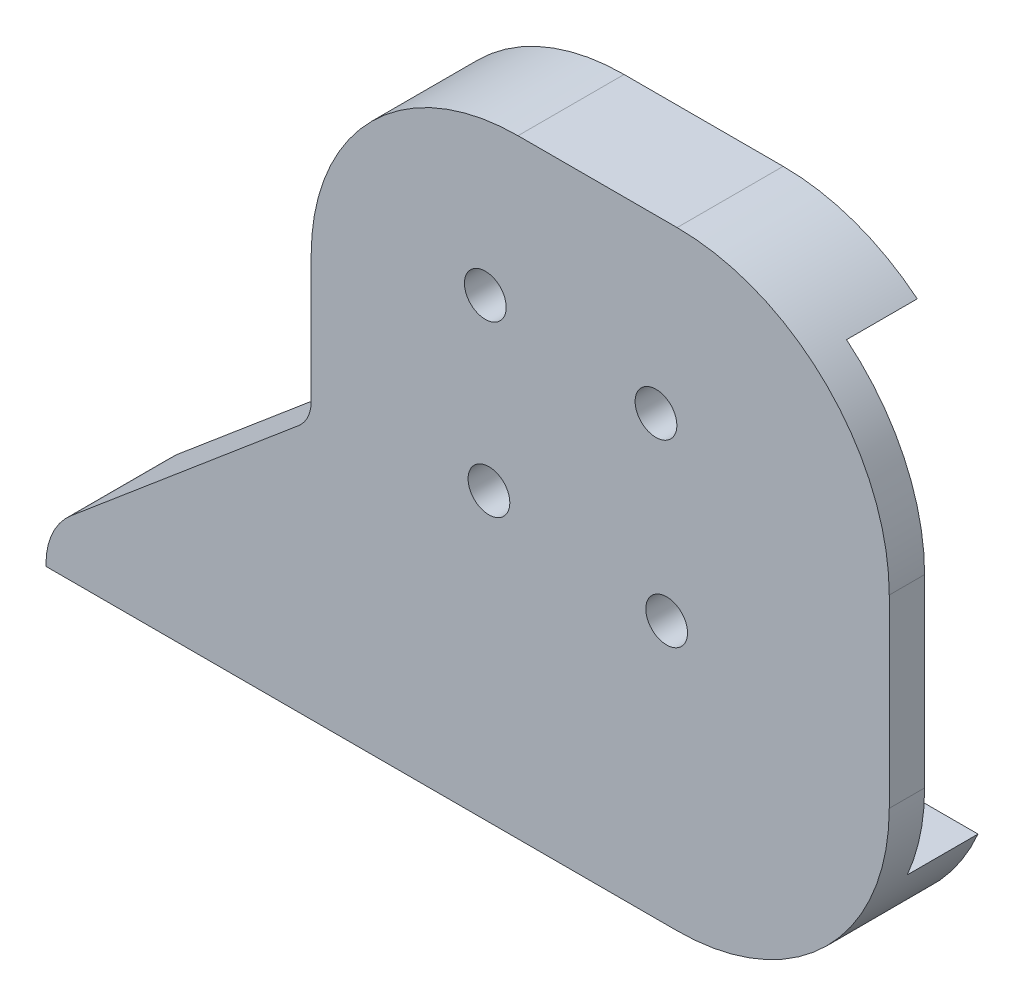
ISO-10303-21;
HEADER;
FILE_DESCRIPTION(('STEP AP214'),'2;1');
FILE_NAME('part.step','',(''),(''),'','','');
FILE_SCHEMA(('AUTOMOTIVE_DESIGN { 1 0 10303 214 1 1 1 1 }'));
ENDSEC;
DATA;
#1=APPLICATION_CONTEXT('core data for automotive mechanical design processes');
#2=APPLICATION_PROTOCOL_DEFINITION('international standard','automotive_design',2000,#1);
#3=PRODUCT_CONTEXT('',#1,'mechanical');
#4=PRODUCT('Part','Part','',(#3));
#5=PRODUCT_RELATED_PRODUCT_CATEGORY('part','',(#4));
#6=PRODUCT_DEFINITION_FORMATION('','',#4);
#7=PRODUCT_DEFINITION_CONTEXT('part definition',#1,'design');
#8=PRODUCT_DEFINITION('design','',#6,#7);
#9=PRODUCT_DEFINITION_SHAPE('','',#8);
#10=(LENGTH_UNIT() NAMED_UNIT(*) SI_UNIT(.MILLI.,.METRE.));
#11=(NAMED_UNIT(*) PLANE_ANGLE_UNIT() SI_UNIT($,.RADIAN.));
#12=(NAMED_UNIT(*) SI_UNIT($,.STERADIAN.) SOLID_ANGLE_UNIT());
#13=UNCERTAINTY_MEASURE_WITH_UNIT(LENGTH_MEASURE(1.E-05),#10,'distance_accuracy_value','');
#14=(GEOMETRIC_REPRESENTATION_CONTEXT(3) GLOBAL_UNCERTAINTY_ASSIGNED_CONTEXT((#13)) GLOBAL_UNIT_ASSIGNED_CONTEXT((#10,
#11,#12)) REPRESENTATION_CONTEXT('',''));
#15=CARTESIAN_POINT('',(0.,0.,0.));
#16=DIRECTION('',(0.,0.,1.));
#17=DIRECTION('',(1.,0.,0.));
#18=AXIS2_PLACEMENT_3D('',#15,#16,#17);
#19=CARTESIAN_POINT('',(0.,16.6219045973045,-7.62));
#20=DIRECTION('',(0.,1.,0.));
#21=DIRECTION('',(0.,0.,1.));
#22=AXIS2_PLACEMENT_3D('',#19,#20,#21);
#23=PLANE('',#22);
#24=DIRECTION('',(-1.,0.,0.));
#25=VECTOR('',#24,1.);
#26=CARTESIAN_POINT('',(0.,16.6219045973045,-7.62));
#27=LINE('',#26,#25);
#28=CARTESIAN_POINT('',(29.1227918090139,16.6219045973045,-7.62));
#29=VERTEX_POINT('',#28);
#30=CARTESIAN_POINT('',(8.0617026182734,16.6219045973045,-7.62));
#31=VERTEX_POINT('',#30);
#32=EDGE_CURVE('E222',#29,#31,#27,.T.);
#33=ORIENTED_EDGE('',*,*,#32,.F.);
#34=DIRECTION('',(0.,0.,1.));
#35=VECTOR('',#34,1.);
#36=CARTESIAN_POINT('',(29.1227918090139,16.6219045973045,-7.62));
#37=LINE('',#36,#35);
#38=CARTESIAN_POINT('',(29.1227918090139,16.6219045973045,-2.54));
#39=VERTEX_POINT('',#38);
#40=EDGE_CURVE('E271',#29,#39,#37,.T.);
#41=ORIENTED_EDGE('',*,*,#40,.T.);
#42=DIRECTION('',(-1.,0.,0.));
#43=VECTOR('',#42,1.);
#44=CARTESIAN_POINT('',(0.,16.6219045973045,-2.54));
#45=LINE('',#44,#43);
#46=CARTESIAN_POINT('',(8.0617026182734,16.6219045973045,-2.54));
#47=VERTEX_POINT('',#46);
#48=EDGE_CURVE('E184',#39,#47,#45,.T.);
#49=ORIENTED_EDGE('',*,*,#48,.T.);
#50=DIRECTION('',(0.,0.,1.));
#51=VECTOR('',#50,1.);
#52=CARTESIAN_POINT('',(8.0617026182734,16.6219045973045,-7.62));
#53=LINE('',#52,#51);
#54=EDGE_CURVE('E249',#31,#47,#53,.T.);
#55=ORIENTED_EDGE('',*,*,#54,.F.);
#56=EDGE_LOOP('',(#33,#41,#49,#55));
#57=FACE_BOUND('',#56,.T.);
#58=ADVANCED_FACE('F35',(#57),#23,.F.);
#59=CARTESIAN_POINT('',(8.0617026182734,5.19190459730453,-7.62));
#60=DIRECTION('',(0.,0.,1.));
#61=DIRECTION('',(1.,0.,0.));
#62=AXIS2_PLACEMENT_3D('',#59,#60,#61);
#63=CYLINDRICAL_SURFACE('',#62,11.43);
#64=CARTESIAN_POINT('',(8.0617026182734,5.19190459730453,-2.54));
#65=DIRECTION('',(0.,0.,1.));
#66=DIRECTION('',(1.,0.,0.));
#67=AXIS2_PLACEMENT_3D('',#64,#65,#66);
#68=CIRCLE('',#67,11.43);
#69=CARTESIAN_POINT('',(-3.3682973817266,5.19190459730453,-2.54));
#70=VERTEX_POINT('',#69);
#71=EDGE_CURVE('E186',#47,#70,#68,.T.);
#72=ORIENTED_EDGE('',*,*,#71,.T.);
#73=DIRECTION('',(0.,0.,1.));
#74=VECTOR('',#73,1.);
#75=CARTESIAN_POINT('',(-3.3682973817266,5.19190459730453,-7.62));
#76=LINE('',#75,#74);
#77=CARTESIAN_POINT('',(-3.3682973817266,5.19190459730453,-7.62));
#78=VERTEX_POINT('',#77);
#79=EDGE_CURVE('E252',#78,#70,#76,.T.);
#80=ORIENTED_EDGE('',*,*,#79,.F.);
#81=CARTESIAN_POINT('',(8.0617026182734,5.19190459730453,-7.62));
#82=DIRECTION('',(0.,0.,1.));
#83=DIRECTION('',(1.,0.,0.));
#84=AXIS2_PLACEMENT_3D('',#81,#82,#83);
#85=CIRCLE('',#84,11.43);
#86=EDGE_CURVE('E220',#31,#78,#85,.T.);
#87=ORIENTED_EDGE('',*,*,#86,.F.);
#88=ORIENTED_EDGE('',*,*,#54,.T.);
#89=EDGE_LOOP('',(#72,#80,#87,#88));
#90=FACE_BOUND('',#89,.T.);
#91=ADVANCED_FACE('F316',(#90),#63,.F.);
#92=CARTESIAN_POINT('',(-3.3682973817266,0.,-7.62));
#93=DIRECTION('',(1.,0.,0.));
#94=DIRECTION('',(0.,0.,-1.));
#95=AXIS2_PLACEMENT_3D('',#92,#93,#94);
#96=PLANE('',#95);
#97=ORIENTED_EDGE('',*,*,#79,.T.);
#98=DIRECTION('',(0.,-1.,0.));
#99=VECTOR('',#98,1.);
#100=CARTESIAN_POINT('',(-3.3682973817266,0.,-2.54));
#101=LINE('',#100,#99);
#102=CARTESIAN_POINT('',(-3.3682973817266,-14.4930954026955,-2.54));
#103=VERTEX_POINT('',#102);
#104=EDGE_CURVE('E175',#70,#103,#101,.T.);
#105=ORIENTED_EDGE('',*,*,#104,.T.);
#106=DIRECTION('',(0.,0.,1.));
#107=VECTOR('',#106,1.);
#108=CARTESIAN_POINT('',(-3.3682973817266,-14.4930954026955,-7.62));
#109=LINE('',#108,#107);
#110=CARTESIAN_POINT('',(-3.3682973817266,-14.4930954026955,-7.62));
#111=VERTEX_POINT('',#110);
#112=EDGE_CURVE('E232',#111,#103,#109,.T.);
#113=ORIENTED_EDGE('',*,*,#112,.F.);
#114=DIRECTION('',(0.,1.,0.));
#115=VECTOR('',#114,1.);
#116=CARTESIAN_POINT('',(-3.3682973817266,0.,-7.62));
#117=LINE('',#116,#115);
#118=EDGE_CURVE('E217',#111,#78,#117,.T.);
#119=ORIENTED_EDGE('',*,*,#118,.T.);
#120=EDGE_LOOP('',(#97,#105,#113,#119));
#121=FACE_BOUND('',#120,.T.);
#122=ADVANCED_FACE('F322',(#121),#96,.T.);
#123=CARTESIAN_POINT('',(0.,-14.4930954026955,-7.62));
#124=DIRECTION('',(0.,1.,0.));
#125=DIRECTION('',(0.,0.,1.));
#126=AXIS2_PLACEMENT_3D('',#123,#124,#125);
#127=PLANE('',#126);
#128=DIRECTION('',(-1.,0.,0.));
#129=VECTOR('',#128,1.);
#130=CARTESIAN_POINT('',(0.,-14.4930954026955,-2.54));
#131=LINE('',#130,#129);
#132=CARTESIAN_POINT('',(33.4869355120126,-14.4930954026955,-2.54));
#133=VERTEX_POINT('',#132);
#134=EDGE_CURVE('E178',#133,#103,#131,.T.);
#135=ORIENTED_EDGE('',*,*,#134,.F.);
#136=DIRECTION('',(0.,0.,1.));
#137=VECTOR('',#136,1.);
#138=CARTESIAN_POINT('',(33.4869355120126,-14.4930954026955,-2.54));
#139=LINE('',#138,#137);
#140=CARTESIAN_POINT('',(33.4869355120126,-14.4930954026955,-7.62));
#141=VERTEX_POINT('',#140);
#142=EDGE_CURVE('E278',#133,#141,#139,.F.);
#143=ORIENTED_EDGE('',*,*,#142,.T.);
#144=DIRECTION('',(-1.,0.,0.));
#145=VECTOR('',#144,1.);
#146=CARTESIAN_POINT('',(0.,-14.4930954026955,-7.62));
#147=LINE('',#146,#145);
#148=EDGE_CURVE('E214',#141,#111,#147,.T.);
#149=ORIENTED_EDGE('',*,*,#148,.T.);
#150=ORIENTED_EDGE('',*,*,#112,.T.);
#151=EDGE_LOOP('',(#135,#143,#149,#150));
#152=FACE_BOUND('',#151,.T.);
#153=ADVANCED_FACE('F332',(#152),#127,.T.);
#154=CARTESIAN_POINT('',(-0.307292450300139,0.364607512732459,-7.62));
#155=DIRECTION('',(-0.644448028300764,0.764648114376317,0.));
#156=DIRECTION('',(-0.764648114376317,-0.644448028300764,0.));
#157=AXIS2_PLACEMENT_3D('',#154,#155,#156);
#158=PLANE('',#157);
#159=DIRECTION('',(-0.764648114376317,-0.644448028300764,0.));
#160=VECTOR('',#159,1.);
#161=CARTESIAN_POINT('',(-0.307292450300139,0.364607512732459,0.));
#162=LINE('',#161,#160);
#163=CARTESIAN_POINT('',(-7.70039938984266,-5.86632813024758,0.));
#164=VERTEX_POINT('',#163);
#165=CARTESIAN_POINT('',(-24.0410933654945,-19.6383205221524,0.));
#166=VERTEX_POINT('',#165);
#167=EDGE_CURVE('E201',#164,#166,#162,.T.);
#168=ORIENTED_EDGE('',*,*,#167,.F.);
#169=DIRECTION('',(0.,0.,1.));
#170=VECTOR('',#169,1.);
#171=CARTESIAN_POINT('',(-7.70039938984266,-5.86632813024758,-7.62));
#172=LINE('',#171,#170);
#173=CARTESIAN_POINT('',(-7.70039938984266,-5.86632813024758,-7.62));
#174=VERTEX_POINT('',#173);
#175=EDGE_CURVE('E56',#164,#174,#172,.F.);
#176=ORIENTED_EDGE('',*,*,#175,.T.);
#177=DIRECTION('',(-0.764648114376317,-0.644448028300764,0.));
#178=VECTOR('',#177,1.);
#179=CARTESIAN_POINT('',(-0.307292450300139,0.364607512732459,-7.62));
#180=LINE('',#179,#178);
#181=CARTESIAN_POINT('',(-24.0410933654945,-19.6383205221524,-7.62));
#182=VERTEX_POINT('',#181);
#183=EDGE_CURVE('E212',#174,#182,#180,.T.);
#184=ORIENTED_EDGE('',*,*,#183,.T.);
#185=DIRECTION('',(0.,0.,1.));
#186=VECTOR('',#185,1.);
#187=CARTESIAN_POINT('',(-24.0410933654945,-19.6383205221524,0.));
#188=LINE('',#187,#186);
#189=EDGE_CURVE('E280',#182,#166,#188,.T.);
#190=ORIENTED_EDGE('',*,*,#189,.T.);
#191=EDGE_LOOP('',(#168,#176,#184,#190));
#192=FACE_BOUND('',#191,.T.);
#193=ADVANCED_FACE('F336',(#192),#158,.T.);
#194=CARTESIAN_POINT('',(-6.7972973817266,0.,-7.62));
#195=DIRECTION('',(-1.,0.,0.));
#196=DIRECTION('',(0.,0.,1.));
#197=AXIS2_PLACEMENT_3D('',#194,#195,#196);
#198=PLANE('',#197);
#199=DIRECTION('',(0.,-1.,0.));
#200=VECTOR('',#199,1.);
#201=CARTESIAN_POINT('',(-6.7972973817266,0.,-7.62));
#202=LINE('',#201,#200);
#203=CARTESIAN_POINT('',(-6.7972973817266,5.19190459730453,-7.62));
#204=VERTEX_POINT('',#203);
#205=CARTESIAN_POINT('',(-6.7972973817266,-3.92412191973173,-7.62));
#206=VERTEX_POINT('',#205);
#207=EDGE_CURVE('E229',#204,#206,#202,.T.);
#208=ORIENTED_EDGE('',*,*,#207,.T.);
#209=DIRECTION('',(0.,0.,1.));
#210=VECTOR('',#209,1.);
#211=CARTESIAN_POINT('',(-6.7972973817266,-3.92412191973173,0.));
#212=LINE('',#211,#210);
#213=CARTESIAN_POINT('',(-6.7972973817266,-3.92412191973173,0.));
#214=VERTEX_POINT('',#213);
#215=EDGE_CURVE('E289',#206,#214,#212,.T.);
#216=ORIENTED_EDGE('',*,*,#215,.T.);
#217=DIRECTION('',(0.,-1.,0.));
#218=VECTOR('',#217,1.);
#219=CARTESIAN_POINT('',(-6.7972973817266,0.,0.));
#220=LINE('',#219,#218);
#221=CARTESIAN_POINT('',(-6.7972973817266,5.19190459730453,0.));
#222=VERTEX_POINT('',#221);
#223=EDGE_CURVE('E215',#222,#214,#220,.T.);
#224=ORIENTED_EDGE('',*,*,#223,.F.);
#225=DIRECTION('',(0.,0.,1.));
#226=VECTOR('',#225,1.);
#227=CARTESIAN_POINT('',(-6.7972973817266,5.19190459730453,-7.62));
#228=LINE('',#227,#226);
#229=EDGE_CURVE('E243',#204,#222,#228,.T.);
#230=ORIENTED_EDGE('',*,*,#229,.F.);
#231=EDGE_LOOP('',(#208,#216,#224,#230));
#232=FACE_BOUND('',#231,.T.);
#233=ADVANCED_FACE('F295',(#232),#198,.T.);
#234=CARTESIAN_POINT('',(8.0617026182734,5.19190459730453,-7.62));
#235=DIRECTION('',(0.,0.,1.));
#236=DIRECTION('',(1.,0.,0.));
#237=AXIS2_PLACEMENT_3D('',#234,#235,#236);
#238=CYLINDRICAL_SURFACE('',#237,14.859);
#239=CARTESIAN_POINT('',(8.0617026182734,5.19190459730453,0.));
#240=DIRECTION('',(0.,0.,1.));
#241=DIRECTION('',(1.,0.,0.));
#242=AXIS2_PLACEMENT_3D('',#239,#240,#241);
#243=CIRCLE('',#242,14.859);
#244=CARTESIAN_POINT('',(8.0617026182734,20.0509045973045,0.));
#245=VERTEX_POINT('',#244);
#246=EDGE_CURVE('E239',#245,#222,#243,.T.);
#247=ORIENTED_EDGE('',*,*,#246,.F.);
#248=DIRECTION('',(0.,0.,1.));
#249=VECTOR('',#248,1.);
#250=CARTESIAN_POINT('',(8.0617026182734,20.0509045973045,-7.62));
#251=LINE('',#250,#249);
#252=CARTESIAN_POINT('',(8.0617026182734,20.0509045973045,-7.62));
#253=VERTEX_POINT('',#252);
#254=EDGE_CURVE('E246',#253,#245,#251,.T.);
#255=ORIENTED_EDGE('',*,*,#254,.F.);
#256=CARTESIAN_POINT('',(8.0617026182734,5.19190459730453,-7.62));
#257=DIRECTION('',(0.,0.,1.));
#258=DIRECTION('',(1.,0.,0.));
#259=AXIS2_PLACEMENT_3D('',#256,#257,#258);
#260=CIRCLE('',#259,14.859);
#261=EDGE_CURVE('E226',#253,#204,#260,.T.);
#262=ORIENTED_EDGE('',*,*,#261,.T.);
#263=ORIENTED_EDGE('',*,*,#229,.T.);
#264=EDGE_LOOP('',(#247,#255,#262,#263));
#265=FACE_BOUND('',#264,.T.);
#266=ADVANCED_FACE('F303',(#265),#238,.T.);
#267=CARTESIAN_POINT('',(0.,20.0509045973045,-7.62));
#268=DIRECTION('',(0.,1.,0.));
#269=DIRECTION('',(0.,0.,1.));
#270=AXIS2_PLACEMENT_3D('',#267,#268,#269);
#271=PLANE('',#270);
#272=DIRECTION('',(-1.,0.,0.));
#273=VECTOR('',#272,1.);
#274=CARTESIAN_POINT('',(0.,20.0509045973045,0.));
#275=LINE('',#274,#273);
#276=CARTESIAN_POINT('',(19.4917026182733,20.0509045973045,0.));
#277=VERTEX_POINT('',#276);
#278=EDGE_CURVE('E237',#277,#245,#275,.T.);
#279=ORIENTED_EDGE('',*,*,#278,.F.);
#280=DIRECTION('',(0.,0.,1.));
#281=VECTOR('',#280,1.);
#282=CARTESIAN_POINT('',(19.4917026182733,20.0509045973045,-7.62));
#283=LINE('',#282,#281);
#284=CARTESIAN_POINT('',(19.4917026182733,20.0509045973045,-7.62));
#285=VERTEX_POINT('',#284);
#286=EDGE_CURVE('E265',#277,#285,#283,.F.);
#287=ORIENTED_EDGE('',*,*,#286,.T.);
#288=DIRECTION('',(-1.,0.,0.));
#289=VECTOR('',#288,1.);
#290=CARTESIAN_POINT('',(0.,20.0509045973045,-7.62));
#291=LINE('',#290,#289);
#292=EDGE_CURVE('E224',#285,#253,#291,.T.);
#293=ORIENTED_EDGE('',*,*,#292,.T.);
#294=ORIENTED_EDGE('',*,*,#254,.T.);
#295=EDGE_LOOP('',(#279,#287,#293,#294));
#296=FACE_BOUND('',#295,.T.);
#297=ADVANCED_FACE('F375',(#296),#271,.T.);
#298=CARTESIAN_POINT('',(34.7317026182734,0.,-7.62));
#299=DIRECTION('',(1.,0.,0.));
#300=DIRECTION('',(0.,1.,0.));
#301=AXIS2_PLACEMENT_3D('',#298,#299,#300);
#302=PLANE('',#301);
#303=DIRECTION('',(0.,1.,0.));
#304=VECTOR('',#303,1.);
#305=CARTESIAN_POINT('',(34.7317026182734,0.,-2.54));
#306=LINE('',#305,#304);
#307=CARTESIAN_POINT('',(34.7317026182734,-8.46059540269546,-2.54));
#308=VERTEX_POINT('',#307);
#309=CARTESIAN_POINT('',(34.7317026182733,4.81090459730455,-2.54));
#310=VERTEX_POINT('',#309);
#311=EDGE_CURVE('E181',#308,#310,#306,.T.);
#312=ORIENTED_EDGE('',*,*,#311,.T.);
#313=DIRECTION('',(0.,0.,1.));
#314=VECTOR('',#313,1.);
#315=CARTESIAN_POINT('',(34.7317026182733,4.81090459730455,-7.62));
#316=LINE('',#315,#314);
#317=CARTESIAN_POINT('',(34.7317026182733,4.81090459730455,0.));
#318=VERTEX_POINT('',#317);
#319=EDGE_CURVE('E258',#310,#318,#316,.T.);
#320=ORIENTED_EDGE('',*,*,#319,.T.);
#321=DIRECTION('',(0.,1.,0.));
#322=VECTOR('',#321,1.);
#323=CARTESIAN_POINT('',(34.7317026182734,0.,0.));
#324=LINE('',#323,#322);
#325=CARTESIAN_POINT('',(34.7317026182734,-8.46059540269546,0.));
#326=VERTEX_POINT('',#325);
#327=EDGE_CURVE('E234',#326,#318,#324,.T.);
#328=ORIENTED_EDGE('',*,*,#327,.F.);
#329=DIRECTION('',(0.,0.,1.));
#330=VECTOR('',#329,1.);
#331=CARTESIAN_POINT('',(34.7317026182734,-8.46059540269546,-7.62));
#332=LINE('',#331,#330);
#333=EDGE_CURVE('E245',#326,#308,#332,.F.);
#334=ORIENTED_EDGE('',*,*,#333,.T.);
#335=EDGE_LOOP('',(#312,#320,#328,#334));
#336=FACE_BOUND('',#335,.T.);
#337=ADVANCED_FACE('F327',(#336),#302,.T.);
#338=CARTESIAN_POINT('',(0.,0.,-7.62));
#339=DIRECTION('',(0.,0.,1.));
#340=DIRECTION('',(1.,0.,0.));
#341=AXIS2_PLACEMENT_3D('',#338,#339,#340);
#342=PLANE('',#341);
#343=DIRECTION('',(0.,1.,0.));
#344=VECTOR('',#343,1.);
#345=CARTESIAN_POINT('',(-25.8472973817266,-23.7005954026955,-7.62));
#346=LINE('',#345,#344);
#347=CARTESIAN_POINT('',(-25.8472973817266,-23.7005954026955,-7.62));
#348=VERTEX_POINT('',#347);
#349=CARTESIAN_POINT('',(-25.8472973817266,-23.5227329431841,-7.62));
#350=VERTEX_POINT('',#349);
#351=EDGE_CURVE('E165',#348,#350,#346,.T.);
#352=ORIENTED_EDGE('',*,*,#351,.T.);
#353=CARTESIAN_POINT('',(-20.7672973817266,-23.5227329431841,-7.62));
#354=DIRECTION('',(0.,0.,1.));
#355=DIRECTION('',(1.,0.,0.));
#356=AXIS2_PLACEMENT_3D('',#353,#354,#355);
#357=CIRCLE('',#356,5.08);
#358=EDGE_CURVE('E286',#350,#182,#357,.F.);
#359=ORIENTED_EDGE('',*,*,#358,.T.);
#360=ORIENTED_EDGE('',*,*,#183,.F.);
#361=CARTESIAN_POINT('',(-9.3372973817266,-3.92412191973173,-7.62));
#362=DIRECTION('',(0.,0.,1.));
#363=DIRECTION('',(1.,0.,0.));
#364=AXIS2_PLACEMENT_3D('',#361,#362,#363);
#365=CIRCLE('',#364,2.54);
#366=EDGE_CURVE('E11',#174,#206,#365,.T.);
#367=ORIENTED_EDGE('',*,*,#366,.T.);
#368=ORIENTED_EDGE('',*,*,#207,.F.);
#369=ORIENTED_EDGE('',*,*,#261,.F.);
#370=ORIENTED_EDGE('',*,*,#292,.F.);
#371=CARTESIAN_POINT('',(19.4917026182733,4.81090459730453,-7.62));
#372=DIRECTION('',(0.,0.,1.));
#373=DIRECTION('',(1.,0.,0.));
#374=AXIS2_PLACEMENT_3D('',#371,#372,#373);
#375=CIRCLE('',#374,15.24);
#376=EDGE_CURVE('E269',#285,#29,#375,.F.);
#377=ORIENTED_EDGE('',*,*,#376,.T.);
#378=ORIENTED_EDGE('',*,*,#32,.T.);
#379=ORIENTED_EDGE('',*,*,#86,.T.);
#380=ORIENTED_EDGE('',*,*,#118,.F.);
#381=ORIENTED_EDGE('',*,*,#148,.F.);
#382=CARTESIAN_POINT('',(19.4917026182734,-8.46059540269547,-7.62));
#383=DIRECTION('',(0.,0.,1.));
#384=DIRECTION('',(1.,0.,0.));
#385=AXIS2_PLACEMENT_3D('',#382,#383,#384);
#386=CIRCLE('',#385,15.24);
#387=CARTESIAN_POINT('',(19.4917026182734,-23.7005954026955,-7.62));
#388=VERTEX_POINT('',#387);
#389=EDGE_CURVE('E267',#141,#388,#386,.F.);
#390=ORIENTED_EDGE('',*,*,#389,.T.);
#391=DIRECTION('',(1.,0.,0.));
#392=VECTOR('',#391,1.);
#393=CARTESIAN_POINT('',(-25.8472973817266,-23.7005954026955,-7.62));
#394=LINE('',#393,#392);
#395=EDGE_CURVE('E170',#348,#388,#394,.T.);
#396=ORIENTED_EDGE('',*,*,#395,.F.);
#397=EDGE_LOOP('',(#352,#359,#360,#367,#368,#369,#370,#377,#378,#379,#380,#381,#390,#396));
#398=FACE_BOUND('',#397,.T.);
#399=ADVANCED_FACE('F307',(#398),#342,.F.);
#400=CARTESIAN_POINT('',(0.,0.,0.));
#401=DIRECTION('',(0.,0.,1.));
#402=DIRECTION('',(1.,0.,0.));
#403=AXIS2_PLACEMENT_3D('',#400,#401,#402);
#404=PLANE('',#403);
#405=ORIENTED_EDGE('',*,*,#223,.T.);
#406=CARTESIAN_POINT('',(-9.3372973817266,-3.92412191973173,0.));
#407=DIRECTION('',(0.,0.,1.));
#408=DIRECTION('',(1.,0.,0.));
#409=AXIS2_PLACEMENT_3D('',#406,#407,#408);
#410=CIRCLE('',#409,2.54);
#411=EDGE_CURVE('E43',#214,#164,#410,.F.);
#412=ORIENTED_EDGE('',*,*,#411,.T.);
#413=ORIENTED_EDGE('',*,*,#167,.T.);
#414=CARTESIAN_POINT('',(-20.7672973817266,-23.5227329431841,0.));
#415=DIRECTION('',(0.,0.,1.));
#416=DIRECTION('',(1.,0.,0.));
#417=AXIS2_PLACEMENT_3D('',#414,#415,#416);
#418=CIRCLE('',#417,5.08);
#419=CARTESIAN_POINT('',(-25.8472973817266,-23.5227329431841,0.));
#420=VERTEX_POINT('',#419);
#421=EDGE_CURVE('E161',#166,#420,#418,.T.);
#422=ORIENTED_EDGE('',*,*,#421,.T.);
#423=DIRECTION('',(0.,1.,0.));
#424=VECTOR('',#423,1.);
#425=CARTESIAN_POINT('',(-25.8472973817266,-23.7005954026955,0.));
#426=LINE('',#425,#424);
#427=CARTESIAN_POINT('',(-25.8472973817266,-23.7005954026955,0.));
#428=VERTEX_POINT('',#427);
#429=EDGE_CURVE('E157',#428,#420,#426,.T.);
#430=ORIENTED_EDGE('',*,*,#429,.F.);
#431=DIRECTION('',(-1.,0.,0.));
#432=VECTOR('',#431,1.);
#433=CARTESIAN_POINT('',(34.7317026182734,-23.7005954026955,0.));
#434=LINE('',#433,#432);
#435=CARTESIAN_POINT('',(19.4917026182734,-23.7005954026955,0.));
#436=VERTEX_POINT('',#435);
#437=EDGE_CURVE('E146',#436,#428,#434,.T.);
#438=ORIENTED_EDGE('',*,*,#437,.F.);
#439=CARTESIAN_POINT('',(19.4917026182734,-8.46059540269547,0.));
#440=DIRECTION('',(0.,0.,1.));
#441=DIRECTION('',(1.,0.,0.));
#442=AXIS2_PLACEMENT_3D('',#439,#440,#441);
#443=CIRCLE('',#442,15.24);
#444=EDGE_CURVE('E261',#436,#326,#443,.T.);
#445=ORIENTED_EDGE('',*,*,#444,.T.);
#446=ORIENTED_EDGE('',*,*,#327,.T.);
#447=CARTESIAN_POINT('',(19.4917026182733,4.81090459730453,0.));
#448=DIRECTION('',(0.,0.,1.));
#449=DIRECTION('',(1.,0.,0.));
#450=AXIS2_PLACEMENT_3D('',#447,#448,#449);
#451=CIRCLE('',#450,15.24);
#452=EDGE_CURVE('E263',#318,#277,#451,.T.);
#453=ORIENTED_EDGE('',*,*,#452,.T.);
#454=ORIENTED_EDGE('',*,*,#278,.T.);
#455=ORIENTED_EDGE('',*,*,#246,.T.);
#456=EDGE_LOOP('',(#405,#412,#413,#422,#430,#438,#445,#446,#453,#454,#455));
#457=FACE_BOUND('',#456,.T.);
#458=CARTESIAN_POINT('',(5.71265972506652,8.94960990800264,0.));
#459=DIRECTION('',(0.,0.,1.));
#460=DIRECTION('',(1.,0.,0.));
#461=AXIS2_PLACEMENT_3D('',#458,#459,#460);
#462=CIRCLE('',#461,1.5);
#463=CARTESIAN_POINT('',(7.21265972506651,8.94960990800264,0.));
#464=VERTEX_POINT('',#463);
#465=EDGE_CURVE('E164',#464,#464,#462,.T.);
#466=ORIENTED_EDGE('',*,*,#465,.F.);
#467=EDGE_LOOP('',(#466));
#468=FACE_BOUND('',#467,.T.);
#469=CARTESIAN_POINT('',(17.9731709595288,7.73325391129376,0.));
#470=DIRECTION('',(0.,0.,1.));
#471=DIRECTION('',(1.,0.,0.));
#472=AXIS2_PLACEMENT_3D('',#469,#470,#471);
#473=CIRCLE('',#472,1.50000000000001);
#474=CARTESIAN_POINT('',(19.4731709595288,7.73325391129376,0.));
#475=VERTEX_POINT('',#474);
#476=EDGE_CURVE('E204',#475,#475,#473,.T.);
#477=ORIENTED_EDGE('',*,*,#476,.F.);
#478=EDGE_LOOP('',(#477));
#479=FACE_BOUND('',#478,.T.);
#480=CARTESIAN_POINT('',(18.7420878165092,-4.79474903084487,0.));
#481=DIRECTION('',(0.,0.,1.));
#482=DIRECTION('',(1.,0.,0.));
#483=AXIS2_PLACEMENT_3D('',#480,#481,#482);
#484=CIRCLE('',#483,1.50000000000001);
#485=CARTESIAN_POINT('',(20.2420878165092,-4.79474903084487,0.));
#486=VERTEX_POINT('',#485);
#487=EDGE_CURVE('E207',#486,#486,#484,.T.);
#488=ORIENTED_EDGE('',*,*,#487,.F.);
#489=EDGE_LOOP('',(#488));
#490=FACE_BOUND('',#489,.T.);
#491=CARTESIAN_POINT('',(5.97317754346705,-3.08198491301326,0.));
#492=DIRECTION('',(0.,0.,1.));
#493=DIRECTION('',(1.,0.,0.));
#494=AXIS2_PLACEMENT_3D('',#491,#492,#493);
#495=CIRCLE('',#494,1.5);
#496=CARTESIAN_POINT('',(7.47317754346704,-3.08198491301326,0.));
#497=VERTEX_POINT('',#496);
#498=EDGE_CURVE('E179',#497,#497,#495,.T.);
#499=ORIENTED_EDGE('',*,*,#498,.F.);
#500=EDGE_LOOP('',(#499));
#501=FACE_BOUND('',#500,.T.);
#502=ADVANCED_FACE('F158',(#457,#468,#479,#490,#501),#404,.T.);
#503=CARTESIAN_POINT('',(18.7420878165092,-4.79474903084487,-2.54));
#504=DIRECTION('',(0.,0.,1.));
#505=DIRECTION('',(1.,0.,0.));
#506=AXIS2_PLACEMENT_3D('',#503,#504,#505);
#507=CYLINDRICAL_SURFACE('',#506,1.50000000000001);
#508=CARTESIAN_POINT('',(18.7420878165092,-4.79474903084487,-2.54));
#509=DIRECTION('',(0.,0.,1.));
#510=DIRECTION('',(1.,0.,0.));
#511=AXIS2_PLACEMENT_3D('',#508,#509,#510);
#512=CIRCLE('',#511,1.50000000000001);
#513=CARTESIAN_POINT('',(20.2420878165092,-4.79474903084487,-2.54));
#514=VERTEX_POINT('',#513);
#515=EDGE_CURVE('E195',#514,#514,#512,.T.);
#516=ORIENTED_EDGE('',*,*,#515,.F.);
#517=EDGE_LOOP('',(#516));
#518=FACE_BOUND('',#517,.T.);
#519=ORIENTED_EDGE('',*,*,#487,.T.);
#520=EDGE_LOOP('',(#519));
#521=FACE_BOUND('',#520,.T.);
#522=ADVANCED_FACE('F387',(#518,#521),#507,.F.);
#523=CARTESIAN_POINT('',(17.9731709595288,7.73325391129376,-2.54));
#524=DIRECTION('',(0.,0.,1.));
#525=DIRECTION('',(1.,0.,0.));
#526=AXIS2_PLACEMENT_3D('',#523,#524,#525);
#527=CYLINDRICAL_SURFACE('',#526,1.50000000000001);
#528=CARTESIAN_POINT('',(17.9731709595288,7.73325391129376,-2.54));
#529=DIRECTION('',(0.,0.,1.));
#530=DIRECTION('',(1.,0.,0.));
#531=AXIS2_PLACEMENT_3D('',#528,#529,#530);
#532=CIRCLE('',#531,1.50000000000001);
#533=CARTESIAN_POINT('',(19.4731709595288,7.73325391129376,-2.54));
#534=VERTEX_POINT('',#533);
#535=EDGE_CURVE('E192',#534,#534,#532,.T.);
#536=ORIENTED_EDGE('',*,*,#535,.F.);
#537=EDGE_LOOP('',(#536));
#538=FACE_BOUND('',#537,.T.);
#539=ORIENTED_EDGE('',*,*,#476,.T.);
#540=EDGE_LOOP('',(#539));
#541=FACE_BOUND('',#540,.T.);
#542=ADVANCED_FACE('F394',(#538,#541),#527,.F.);
#543=CARTESIAN_POINT('',(5.71265972506652,8.94960990800264,-2.54));
#544=DIRECTION('',(0.,0.,1.));
#545=DIRECTION('',(1.,0.,0.));
#546=AXIS2_PLACEMENT_3D('',#543,#544,#545);
#547=CYLINDRICAL_SURFACE('',#546,1.5);
#548=CARTESIAN_POINT('',(5.71265972506652,8.94960990800264,-2.54));
#549=DIRECTION('',(0.,0.,1.));
#550=DIRECTION('',(1.,0.,0.));
#551=AXIS2_PLACEMENT_3D('',#548,#549,#550);
#552=CIRCLE('',#551,1.5);
#553=CARTESIAN_POINT('',(7.21265972506651,8.94960990800264,-2.54));
#554=VERTEX_POINT('',#553);
#555=EDGE_CURVE('E189',#554,#554,#552,.T.);
#556=ORIENTED_EDGE('',*,*,#555,.F.);
#557=EDGE_LOOP('',(#556));
#558=FACE_BOUND('',#557,.T.);
#559=ORIENTED_EDGE('',*,*,#465,.T.);
#560=EDGE_LOOP('',(#559));
#561=FACE_BOUND('',#560,.T.);
#562=ADVANCED_FACE('F390',(#558,#561),#547,.F.);
#563=CARTESIAN_POINT('',(5.97317754346705,-3.08198491301326,-2.54));
#564=DIRECTION('',(0.,0.,1.));
#565=DIRECTION('',(1.,0.,0.));
#566=AXIS2_PLACEMENT_3D('',#563,#564,#565);
#567=CYLINDRICAL_SURFACE('',#566,1.5);
#568=CARTESIAN_POINT('',(5.97317754346705,-3.08198491301326,-2.54));
#569=DIRECTION('',(0.,0.,1.));
#570=DIRECTION('',(1.,0.,0.));
#571=AXIS2_PLACEMENT_3D('',#568,#569,#570);
#572=CIRCLE('',#571,1.5);
#573=CARTESIAN_POINT('',(7.47317754346704,-3.08198491301326,-2.54));
#574=VERTEX_POINT('',#573);
#575=EDGE_CURVE('E198',#574,#574,#572,.T.);
#576=ORIENTED_EDGE('',*,*,#575,.F.);
#577=EDGE_LOOP('',(#576));
#578=FACE_BOUND('',#577,.T.);
#579=ORIENTED_EDGE('',*,*,#498,.T.);
#580=EDGE_LOOP('',(#579));
#581=FACE_BOUND('',#580,.T.);
#582=ADVANCED_FACE('F393',(#578,#581),#567,.F.);
#583=CARTESIAN_POINT('',(0.,0.,-2.54));
#584=DIRECTION('',(0.,0.,1.));
#585=DIRECTION('',(1.,0.,0.));
#586=AXIS2_PLACEMENT_3D('',#583,#584,#585);
#587=PLANE('',#586);
#588=ORIENTED_EDGE('',*,*,#48,.F.);
#589=CARTESIAN_POINT('',(19.4917026182733,4.81090459730453,-2.54));
#590=DIRECTION('',(0.,0.,1.));
#591=DIRECTION('',(1.,0.,0.));
#592=AXIS2_PLACEMENT_3D('',#589,#590,#591);
#593=CIRCLE('',#592,15.24);
#594=EDGE_CURVE('E275',#39,#310,#593,.F.);
#595=ORIENTED_EDGE('',*,*,#594,.T.);
#596=ORIENTED_EDGE('',*,*,#311,.F.);
#597=CARTESIAN_POINT('',(19.4917026182734,-8.46059540269547,-2.54));
#598=DIRECTION('',(0.,0.,1.));
#599=DIRECTION('',(1.,0.,0.));
#600=AXIS2_PLACEMENT_3D('',#597,#598,#599);
#601=CIRCLE('',#600,15.24);
#602=EDGE_CURVE('E273',#308,#133,#601,.F.);
#603=ORIENTED_EDGE('',*,*,#602,.T.);
#604=ORIENTED_EDGE('',*,*,#134,.T.);
#605=ORIENTED_EDGE('',*,*,#104,.F.);
#606=ORIENTED_EDGE('',*,*,#71,.F.);
#607=EDGE_LOOP('',(#588,#595,#596,#603,#604,#605,#606));
#608=FACE_BOUND('',#607,.T.);
#609=ORIENTED_EDGE('',*,*,#555,.T.);
#610=EDGE_LOOP('',(#609));
#611=FACE_BOUND('',#610,.T.);
#612=ORIENTED_EDGE('',*,*,#535,.T.);
#613=EDGE_LOOP('',(#612));
#614=FACE_BOUND('',#613,.T.);
#615=ORIENTED_EDGE('',*,*,#515,.T.);
#616=EDGE_LOOP('',(#615));
#617=FACE_BOUND('',#616,.T.);
#618=ORIENTED_EDGE('',*,*,#575,.T.);
#619=EDGE_LOOP('',(#618));
#620=FACE_BOUND('',#619,.T.);
#621=ADVANCED_FACE('F356',(#608,#611,#614,#617,#620),#587,.F.);
#622=CARTESIAN_POINT('',(-25.8472973817266,-23.7005954026955,0.));
#623=DIRECTION('',(1.,0.,0.));
#624=DIRECTION('',(0.,0.,-1.));
#625=AXIS2_PLACEMENT_3D('',#622,#623,#624);
#626=PLANE('',#625);
#627=ORIENTED_EDGE('',*,*,#429,.T.);
#628=DIRECTION('',(0.,0.,1.));
#629=VECTOR('',#628,1.);
#630=CARTESIAN_POINT('',(-25.8472973817266,-23.5227329431841,-7.62));
#631=LINE('',#630,#629);
#632=EDGE_CURVE('E284',#420,#350,#631,.F.);
#633=ORIENTED_EDGE('',*,*,#632,.T.);
#634=ORIENTED_EDGE('',*,*,#351,.F.);
#635=DIRECTION('',(0.,0.,-1.));
#636=VECTOR('',#635,1.);
#637=CARTESIAN_POINT('',(-25.8472973817266,-23.7005954026955,0.));
#638=LINE('',#637,#636);
#639=EDGE_CURVE('E151',#428,#348,#638,.T.);
#640=ORIENTED_EDGE('',*,*,#639,.F.);
#641=EDGE_LOOP('',(#627,#633,#634,#640));
#642=FACE_BOUND('',#641,.T.);
#643=ADVANCED_FACE('F167',(#642),#626,.F.);
#644=CARTESIAN_POINT('',(0.,-23.7005954026955,0.));
#645=DIRECTION('',(0.,-1.,0.));
#646=DIRECTION('',(0.,0.,-1.));
#647=AXIS2_PLACEMENT_3D('',#644,#645,#646);
#648=PLANE('',#647);
#649=ORIENTED_EDGE('',*,*,#395,.T.);
#650=DIRECTION('',(0.,0.,1.));
#651=VECTOR('',#650,1.);
#652=CARTESIAN_POINT('',(19.4917026182734,-23.7005954026955,0.));
#653=LINE('',#652,#651);
#654=EDGE_CURVE('E154',#388,#436,#653,.T.);
#655=ORIENTED_EDGE('',*,*,#654,.T.);
#656=ORIENTED_EDGE('',*,*,#437,.T.);
#657=ORIENTED_EDGE('',*,*,#639,.T.);
#658=EDGE_LOOP('',(#649,#655,#656,#657));
#659=FACE_BOUND('',#658,.T.);
#660=ADVANCED_FACE('F149',(#659),#648,.T.);
#661=CARTESIAN_POINT('',(19.4917026182733,4.81090459730453,-7.62));
#662=DIRECTION('',(0.,0.,1.));
#663=DIRECTION('',(1.,0.,0.));
#664=AXIS2_PLACEMENT_3D('',#661,#662,#663);
#665=CYLINDRICAL_SURFACE('',#664,15.24);
#666=ORIENTED_EDGE('',*,*,#376,.F.);
#667=ORIENTED_EDGE('',*,*,#286,.F.);
#668=ORIENTED_EDGE('',*,*,#452,.F.);
#669=ORIENTED_EDGE('',*,*,#319,.F.);
#670=ORIENTED_EDGE('',*,*,#594,.F.);
#671=ORIENTED_EDGE('',*,*,#40,.F.);
#672=EDGE_LOOP('',(#666,#667,#668,#669,#670,#671));
#673=FACE_BOUND('',#672,.T.);
#674=ADVANCED_FACE('F340',(#673),#665,.T.);
#675=CARTESIAN_POINT('',(19.4917026182734,-8.46059540269547,0.));
#676=DIRECTION('',(0.,0.,1.));
#677=DIRECTION('',(1.,0.,0.));
#678=AXIS2_PLACEMENT_3D('',#675,#676,#677);
#679=CYLINDRICAL_SURFACE('',#678,15.24);
#680=ORIENTED_EDGE('',*,*,#602,.F.);
#681=ORIENTED_EDGE('',*,*,#333,.F.);
#682=ORIENTED_EDGE('',*,*,#444,.F.);
#683=ORIENTED_EDGE('',*,*,#654,.F.);
#684=ORIENTED_EDGE('',*,*,#389,.F.);
#685=ORIENTED_EDGE('',*,*,#142,.F.);
#686=EDGE_LOOP('',(#680,#681,#682,#683,#684,#685));
#687=FACE_BOUND('',#686,.T.);
#688=ADVANCED_FACE('F313',(#687),#679,.T.);
#689=CARTESIAN_POINT('',(-20.7672973817266,-23.5227329431841,-7.62));
#690=DIRECTION('',(0.,0.,-1.));
#691=DIRECTION('',(-1.,0.,0.));
#692=AXIS2_PLACEMENT_3D('',#689,#690,#691);
#693=CYLINDRICAL_SURFACE('',#692,5.08);
#694=ORIENTED_EDGE('',*,*,#358,.F.);
#695=ORIENTED_EDGE('',*,*,#632,.F.);
#696=ORIENTED_EDGE('',*,*,#421,.F.);
#697=ORIENTED_EDGE('',*,*,#189,.F.);
#698=EDGE_LOOP('',(#694,#695,#696,#697));
#699=FACE_BOUND('',#698,.T.);
#700=ADVANCED_FACE('F309',(#699),#693,.T.);
#701=CARTESIAN_POINT('',(-9.3372973817266,-3.92412191973173,-7.62));
#702=DIRECTION('',(0.,0.,-1.));
#703=DIRECTION('',(-1.,0.,0.));
#704=AXIS2_PLACEMENT_3D('',#701,#702,#703);
#705=CYLINDRICAL_SURFACE('',#704,2.54);
#706=ORIENTED_EDGE('',*,*,#366,.F.);
#707=ORIENTED_EDGE('',*,*,#175,.F.);
#708=ORIENTED_EDGE('',*,*,#411,.F.);
#709=ORIENTED_EDGE('',*,*,#215,.F.);
#710=EDGE_LOOP('',(#706,#707,#708,#709));
#711=FACE_BOUND('',#710,.T.);
#712=ADVANCED_FACE('F37',(#711),#705,.F.);
#713=CLOSED_SHELL('',(#58,#91,#122,#153,#193,#233,#266,#297,#337,#399,#502,#522,#542,#562,#582,
#621,#643,#660,#674,#688,#700,#712));
#714=MANIFOLD_SOLID_BREP('B2',#713);
#715=ADVANCED_BREP_SHAPE_REPRESENTATION('',(#18,#714),#14);
#716=SHAPE_DEFINITION_REPRESENTATION(#9,#715);
ENDSEC;
END-ISO-10303-21;
